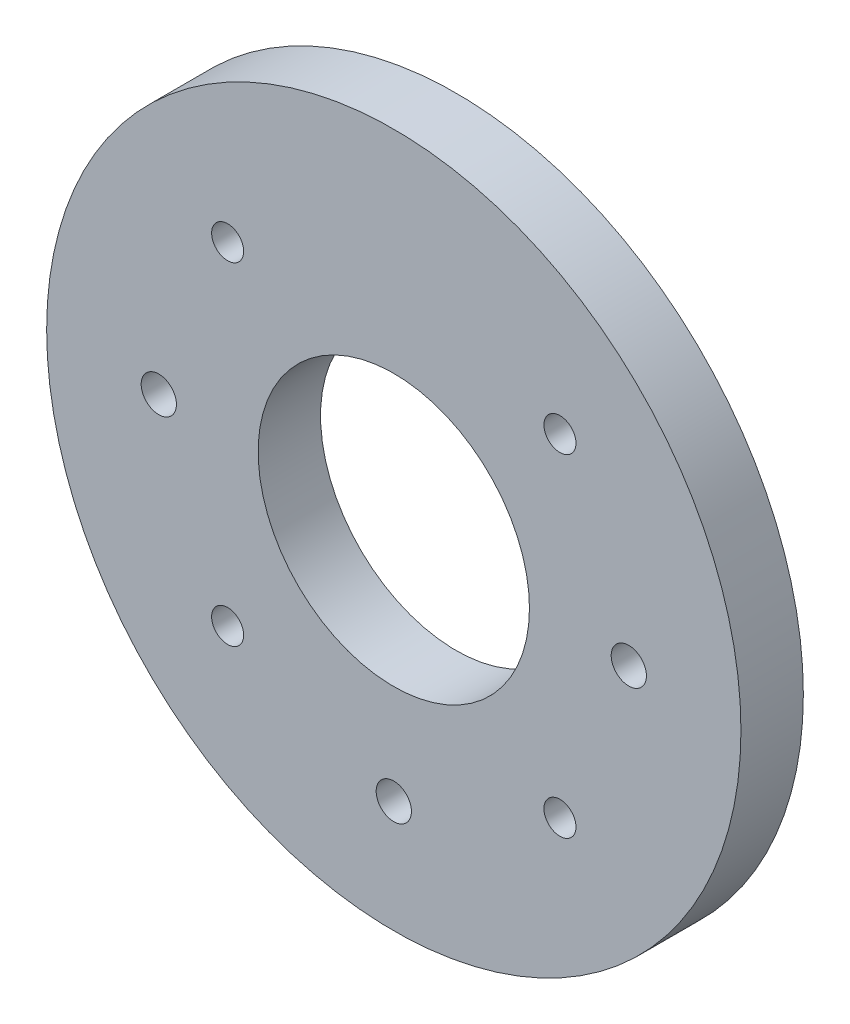
ISO-10303-21;
HEADER;
FILE_DESCRIPTION(('STEP AP214'),'2;1');
FILE_NAME('part.step','',(''),(''),'','','');
FILE_SCHEMA(('AUTOMOTIVE_DESIGN { 1 0 10303 214 1 1 1 1 }'));
ENDSEC;
DATA;
#1=APPLICATION_CONTEXT('core data for automotive mechanical design processes');
#2=APPLICATION_PROTOCOL_DEFINITION('international standard','automotive_design',2000,#1);
#3=PRODUCT_CONTEXT('',#1,'mechanical');
#4=PRODUCT('Part','Part','',(#3));
#5=PRODUCT_RELATED_PRODUCT_CATEGORY('part','',(#4));
#6=PRODUCT_DEFINITION_FORMATION('','',#4);
#7=PRODUCT_DEFINITION_CONTEXT('part definition',#1,'design');
#8=PRODUCT_DEFINITION('design','',#6,#7);
#9=PRODUCT_DEFINITION_SHAPE('','',#8);
#10=(LENGTH_UNIT() NAMED_UNIT(*) SI_UNIT(.MILLI.,.METRE.));
#11=(NAMED_UNIT(*) PLANE_ANGLE_UNIT() SI_UNIT($,.RADIAN.));
#12=(NAMED_UNIT(*) SI_UNIT($,.STERADIAN.) SOLID_ANGLE_UNIT());
#13=UNCERTAINTY_MEASURE_WITH_UNIT(LENGTH_MEASURE(1.E-05),#10,'distance_accuracy_value','');
#14=(GEOMETRIC_REPRESENTATION_CONTEXT(3) GLOBAL_UNCERTAINTY_ASSIGNED_CONTEXT((#13)) GLOBAL_UNIT_ASSIGNED_CONTEXT((#10,
#11,#12)) REPRESENTATION_CONTEXT('',''));
#15=CARTESIAN_POINT('',(0.,0.,0.));
#16=DIRECTION('',(0.,0.,1.));
#17=DIRECTION('',(1.,0.,0.));
#18=AXIS2_PLACEMENT_3D('',#15,#16,#17);
#19=CARTESIAN_POINT('',(0.,0.,5.842));
#20=DIRECTION('',(0.,0.,-1.));
#21=DIRECTION('',(-1.,0.,0.));
#22=AXIS2_PLACEMENT_3D('',#19,#20,#21);
#23=CYLINDRICAL_SURFACE('',#22,12.7);
#24=CARTESIAN_POINT('',(0.,0.,5.842));
#25=DIRECTION('',(0.,0.,1.));
#26=DIRECTION('',(1.,0.,0.));
#27=AXIS2_PLACEMENT_3D('',#24,#25,#26);
#28=CIRCLE('',#27,12.7);
#29=CARTESIAN_POINT('',(12.7,0.,5.842));
#30=VERTEX_POINT('',#29);
#31=EDGE_CURVE('E41',#30,#30,#28,.T.);
#32=ORIENTED_EDGE('',*,*,#31,.T.);
#33=EDGE_LOOP('',(#32));
#34=FACE_BOUND('',#33,.T.);
#35=CARTESIAN_POINT('',(0.,0.,0.));
#36=DIRECTION('',(0.,0.,1.));
#37=DIRECTION('',(1.,0.,0.));
#38=AXIS2_PLACEMENT_3D('',#35,#36,#37);
#39=CIRCLE('',#38,12.7);
#40=CARTESIAN_POINT('',(12.7,0.,0.));
#41=VERTEX_POINT('',#40);
#42=EDGE_CURVE('E59',#41,#41,#39,.T.);
#43=ORIENTED_EDGE('',*,*,#42,.F.);
#44=EDGE_LOOP('',(#43));
#45=FACE_BOUND('',#44,.T.);
#46=ADVANCED_FACE('F33',(#34,#45),#23,.F.);
#47=CARTESIAN_POINT('',(22.,0.,5.842));
#48=DIRECTION('',(0.,0.,-1.));
#49=DIRECTION('',(-1.,0.,0.));
#50=AXIS2_PLACEMENT_3D('',#47,#48,#49);
#51=CYLINDRICAL_SURFACE('',#50,1.65);
#52=CARTESIAN_POINT('',(22.,0.,5.842));
#53=DIRECTION('',(0.,0.,1.));
#54=DIRECTION('',(1.,0.,0.));
#55=AXIS2_PLACEMENT_3D('',#52,#53,#54);
#56=CIRCLE('',#55,1.65);
#57=CARTESIAN_POINT('',(23.65,0.,5.842));
#58=VERTEX_POINT('',#57);
#59=EDGE_CURVE('E46',#58,#58,#56,.T.);
#60=ORIENTED_EDGE('',*,*,#59,.T.);
#61=EDGE_LOOP('',(#60));
#62=FACE_BOUND('',#61,.T.);
#63=CARTESIAN_POINT('',(22.,0.,0.));
#64=DIRECTION('',(0.,0.,1.));
#65=DIRECTION('',(1.,0.,0.));
#66=AXIS2_PLACEMENT_3D('',#63,#64,#65);
#67=CIRCLE('',#66,1.65);
#68=CARTESIAN_POINT('',(23.65,0.,0.));
#69=VERTEX_POINT('',#68);
#70=EDGE_CURVE('E57',#69,#69,#67,.T.);
#71=ORIENTED_EDGE('',*,*,#70,.F.);
#72=EDGE_LOOP('',(#71));
#73=FACE_BOUND('',#72,.T.);
#74=ADVANCED_FACE('F80',(#62,#73),#51,.F.);
#75=CARTESIAN_POINT('',(0.,-22.,5.842));
#76=DIRECTION('',(0.,0.,-1.));
#77=DIRECTION('',(-1.,0.,0.));
#78=AXIS2_PLACEMENT_3D('',#75,#76,#77);
#79=CYLINDRICAL_SURFACE('',#78,1.65);
#80=CARTESIAN_POINT('',(0.,-22.,5.842));
#81=DIRECTION('',(0.,0.,1.));
#82=DIRECTION('',(1.,0.,0.));
#83=AXIS2_PLACEMENT_3D('',#80,#81,#82);
#84=CIRCLE('',#83,1.65);
#85=CARTESIAN_POINT('',(1.65,-22.,5.842));
#86=VERTEX_POINT('',#85);
#87=EDGE_CURVE('E68',#86,#86,#84,.T.);
#88=ORIENTED_EDGE('',*,*,#87,.T.);
#89=EDGE_LOOP('',(#88));
#90=FACE_BOUND('',#89,.T.);
#91=CARTESIAN_POINT('',(0.,-22.,0.));
#92=DIRECTION('',(0.,0.,1.));
#93=DIRECTION('',(1.,0.,0.));
#94=AXIS2_PLACEMENT_3D('',#91,#92,#93);
#95=CIRCLE('',#94,1.65);
#96=CARTESIAN_POINT('',(1.65,-22.,0.));
#97=VERTEX_POINT('',#96);
#98=EDGE_CURVE('E53',#97,#97,#95,.T.);
#99=ORIENTED_EDGE('',*,*,#98,.F.);
#100=EDGE_LOOP('',(#99));
#101=FACE_BOUND('',#100,.T.);
#102=ADVANCED_FACE('F98',(#90,#101),#79,.F.);
#103=CARTESIAN_POINT('',(-22.,0.,5.842));
#104=DIRECTION('',(0.,0.,-1.));
#105=DIRECTION('',(-1.,0.,0.));
#106=AXIS2_PLACEMENT_3D('',#103,#104,#105);
#107=CYLINDRICAL_SURFACE('',#106,1.65);
#108=CARTESIAN_POINT('',(-22.,0.,5.842));
#109=DIRECTION('',(0.,0.,1.));
#110=DIRECTION('',(1.,0.,0.));
#111=AXIS2_PLACEMENT_3D('',#108,#109,#110);
#112=CIRCLE('',#111,1.65);
#113=CARTESIAN_POINT('',(-20.35,0.,5.842));
#114=VERTEX_POINT('',#113);
#115=EDGE_CURVE('E64',#114,#114,#112,.T.);
#116=ORIENTED_EDGE('',*,*,#115,.T.);
#117=EDGE_LOOP('',(#116));
#118=FACE_BOUND('',#117,.T.);
#119=CARTESIAN_POINT('',(-22.,0.,0.));
#120=DIRECTION('',(0.,0.,1.));
#121=DIRECTION('',(1.,0.,0.));
#122=AXIS2_PLACEMENT_3D('',#119,#120,#121);
#123=CIRCLE('',#122,1.65);
#124=CARTESIAN_POINT('',(-20.35,0.,0.));
#125=VERTEX_POINT('',#124);
#126=EDGE_CURVE('E50',#125,#125,#123,.T.);
#127=ORIENTED_EDGE('',*,*,#126,.F.);
#128=EDGE_LOOP('',(#127));
#129=FACE_BOUND('',#128,.T.);
#130=ADVANCED_FACE('F35',(#118,#129),#107,.F.);
#131=CARTESIAN_POINT('',(0.,0.,5.842));
#132=DIRECTION('',(0.,0.,-1.));
#133=DIRECTION('',(-1.,0.,0.));
#134=AXIS2_PLACEMENT_3D('',#131,#132,#133);
#135=CYLINDRICAL_SURFACE('',#134,32.5);
#136=CARTESIAN_POINT('',(0.,0.,5.842));
#137=DIRECTION('',(0.,0.,1.));
#138=DIRECTION('',(1.,0.,0.));
#139=AXIS2_PLACEMENT_3D('',#136,#137,#138);
#140=CIRCLE('',#139,32.5);
#141=CARTESIAN_POINT('',(32.5,0.,5.842));
#142=VERTEX_POINT('',#141);
#143=EDGE_CURVE('E10',#142,#142,#140,.T.);
#144=ORIENTED_EDGE('',*,*,#143,.F.);
#145=EDGE_LOOP('',(#144));
#146=FACE_BOUND('',#145,.T.);
#147=CARTESIAN_POINT('',(0.,0.,0.));
#148=DIRECTION('',(0.,0.,1.));
#149=DIRECTION('',(1.,0.,0.));
#150=AXIS2_PLACEMENT_3D('',#147,#148,#149);
#151=CIRCLE('',#150,32.5);
#152=CARTESIAN_POINT('',(32.5,0.,0.));
#153=VERTEX_POINT('',#152);
#154=EDGE_CURVE('E37',#153,#153,#151,.T.);
#155=ORIENTED_EDGE('',*,*,#154,.T.);
#156=EDGE_LOOP('',(#155));
#157=FACE_BOUND('',#156,.T.);
#158=ADVANCED_FACE('F87',(#146,#157),#135,.T.);
#159=CARTESIAN_POINT('',(0.,0.,5.842));
#160=DIRECTION('',(0.,0.,1.));
#161=DIRECTION('',(1.,0.,0.));
#162=AXIS2_PLACEMENT_3D('',#159,#160,#161);
#163=PLANE('',#162);
#164=CARTESIAN_POINT('',(15.5563491861041,-15.556349186104,5.842));
#165=DIRECTION('',(0.,0.,1.));
#166=DIRECTION('',(1.,0.,0.));
#167=AXIS2_PLACEMENT_3D('',#164,#165,#166);
#168=CIRCLE('',#167,1.5);
#169=CARTESIAN_POINT('',(17.0563491861041,-15.556349186104,5.842));
#170=VERTEX_POINT('',#169);
#171=EDGE_CURVE('E143',#170,#170,#168,.T.);
#172=ORIENTED_EDGE('',*,*,#171,.F.);
#173=EDGE_LOOP('',(#172));
#174=FACE_BOUND('',#173,.T.);
#175=CARTESIAN_POINT('',(15.556349186104,15.5563491861041,5.842));
#176=DIRECTION('',(0.,0.,1.));
#177=DIRECTION('',(1.,0.,0.));
#178=AXIS2_PLACEMENT_3D('',#175,#176,#177);
#179=CIRCLE('',#178,1.5);
#180=CARTESIAN_POINT('',(17.056349186104,15.5563491861041,5.842));
#181=VERTEX_POINT('',#180);
#182=EDGE_CURVE('E145',#181,#181,#179,.T.);
#183=ORIENTED_EDGE('',*,*,#182,.F.);
#184=EDGE_LOOP('',(#183));
#185=FACE_BOUND('',#184,.T.);
#186=CARTESIAN_POINT('',(-15.5563491861041,15.556349186104,5.842));
#187=DIRECTION('',(0.,0.,1.));
#188=DIRECTION('',(1.,0.,0.));
#189=AXIS2_PLACEMENT_3D('',#186,#187,#188);
#190=CIRCLE('',#189,1.5);
#191=CARTESIAN_POINT('',(-14.0563491861041,15.556349186104,5.842));
#192=VERTEX_POINT('',#191);
#193=EDGE_CURVE('E151',#192,#192,#190,.T.);
#194=ORIENTED_EDGE('',*,*,#193,.F.);
#195=EDGE_LOOP('',(#194));
#196=FACE_BOUND('',#195,.T.);
#197=CARTESIAN_POINT('',(-15.556349186104,-15.5563491861041,5.842));
#198=DIRECTION('',(0.,0.,1.));
#199=DIRECTION('',(1.,0.,0.));
#200=AXIS2_PLACEMENT_3D('',#197,#198,#199);
#201=CIRCLE('',#200,1.5);
#202=CARTESIAN_POINT('',(-14.056349186104,-15.5563491861041,5.842));
#203=VERTEX_POINT('',#202);
#204=EDGE_CURVE('E75',#203,#203,#201,.T.);
#205=ORIENTED_EDGE('',*,*,#204,.F.);
#206=EDGE_LOOP('',(#205));
#207=FACE_BOUND('',#206,.T.);
#208=ORIENTED_EDGE('',*,*,#115,.F.);
#209=EDGE_LOOP('',(#208));
#210=FACE_BOUND('',#209,.T.);
#211=ORIENTED_EDGE('',*,*,#87,.F.);
#212=EDGE_LOOP('',(#211));
#213=FACE_BOUND('',#212,.T.);
#214=ORIENTED_EDGE('',*,*,#59,.F.);
#215=EDGE_LOOP('',(#214));
#216=FACE_BOUND('',#215,.T.);
#217=ORIENTED_EDGE('',*,*,#31,.F.);
#218=EDGE_LOOP('',(#217));
#219=FACE_BOUND('',#218,.T.);
#220=ORIENTED_EDGE('',*,*,#143,.T.);
#221=EDGE_LOOP('',(#220));
#222=FACE_BOUND('',#221,.T.);
#223=ADVANCED_FACE('F83',(#174,#185,#196,#207,#210,#213,#216,#219,#222),#163,.T.);
#224=CARTESIAN_POINT('',(0.,0.,0.));
#225=DIRECTION('',(0.,0.,1.));
#226=DIRECTION('',(1.,0.,0.));
#227=AXIS2_PLACEMENT_3D('',#224,#225,#226);
#228=PLANE('',#227);
#229=CARTESIAN_POINT('',(15.5563491861041,-15.556349186104,0.));
#230=DIRECTION('',(0.,0.,1.));
#231=DIRECTION('',(1.,0.,0.));
#232=AXIS2_PLACEMENT_3D('',#229,#230,#231);
#233=CIRCLE('',#232,1.5);
#234=CARTESIAN_POINT('',(17.0563491861041,-15.556349186104,0.));
#235=VERTEX_POINT('',#234);
#236=EDGE_CURVE('E140',#235,#235,#233,.T.);
#237=ORIENTED_EDGE('',*,*,#236,.T.);
#238=EDGE_LOOP('',(#237));
#239=FACE_BOUND('',#238,.T.);
#240=CARTESIAN_POINT('',(15.556349186104,15.5563491861041,0.));
#241=DIRECTION('',(0.,0.,1.));
#242=DIRECTION('',(1.,0.,0.));
#243=AXIS2_PLACEMENT_3D('',#240,#241,#242);
#244=CIRCLE('',#243,1.5);
#245=CARTESIAN_POINT('',(17.056349186104,15.5563491861041,0.));
#246=VERTEX_POINT('',#245);
#247=EDGE_CURVE('E148',#246,#246,#244,.T.);
#248=ORIENTED_EDGE('',*,*,#247,.T.);
#249=EDGE_LOOP('',(#248));
#250=FACE_BOUND('',#249,.T.);
#251=CARTESIAN_POINT('',(-15.5563491861041,15.556349186104,0.));
#252=DIRECTION('',(0.,0.,1.));
#253=DIRECTION('',(1.,0.,0.));
#254=AXIS2_PLACEMENT_3D('',#251,#252,#253);
#255=CIRCLE('',#254,1.5);
#256=CARTESIAN_POINT('',(-14.0563491861041,15.556349186104,0.));
#257=VERTEX_POINT('',#256);
#258=EDGE_CURVE('E154',#257,#257,#255,.T.);
#259=ORIENTED_EDGE('',*,*,#258,.T.);
#260=EDGE_LOOP('',(#259));
#261=FACE_BOUND('',#260,.T.);
#262=CARTESIAN_POINT('',(-15.556349186104,-15.5563491861041,0.));
#263=DIRECTION('',(0.,0.,1.));
#264=DIRECTION('',(1.,0.,0.));
#265=AXIS2_PLACEMENT_3D('',#262,#263,#264);
#266=CIRCLE('',#265,1.5);
#267=CARTESIAN_POINT('',(-14.056349186104,-15.5563491861041,0.));
#268=VERTEX_POINT('',#267);
#269=EDGE_CURVE('E54',#268,#268,#266,.T.);
#270=ORIENTED_EDGE('',*,*,#269,.T.);
#271=EDGE_LOOP('',(#270));
#272=FACE_BOUND('',#271,.T.);
#273=ORIENTED_EDGE('',*,*,#126,.T.);
#274=EDGE_LOOP('',(#273));
#275=FACE_BOUND('',#274,.T.);
#276=ORIENTED_EDGE('',*,*,#98,.T.);
#277=EDGE_LOOP('',(#276));
#278=FACE_BOUND('',#277,.T.);
#279=ORIENTED_EDGE('',*,*,#70,.T.);
#280=EDGE_LOOP('',(#279));
#281=FACE_BOUND('',#280,.T.);
#282=ORIENTED_EDGE('',*,*,#42,.T.);
#283=EDGE_LOOP('',(#282));
#284=FACE_BOUND('',#283,.T.);
#285=ORIENTED_EDGE('',*,*,#154,.F.);
#286=EDGE_LOOP('',(#285));
#287=FACE_BOUND('',#286,.T.);
#288=ADVANCED_FACE('F86',(#239,#250,#261,#272,#275,#278,#281,#284,#287),#228,.F.);
#289=CARTESIAN_POINT('',(-15.556349186104,-15.5563491861041,0.));
#290=DIRECTION('',(0.,0.,1.));
#291=DIRECTION('',(1.,0.,0.));
#292=AXIS2_PLACEMENT_3D('',#289,#290,#291);
#293=CYLINDRICAL_SURFACE('',#292,1.5);
#294=ORIENTED_EDGE('',*,*,#269,.F.);
#295=EDGE_LOOP('',(#294));
#296=FACE_BOUND('',#295,.T.);
#297=ORIENTED_EDGE('',*,*,#204,.T.);
#298=EDGE_LOOP('',(#297));
#299=FACE_BOUND('',#298,.T.);
#300=ADVANCED_FACE('F113',(#296,#299),#293,.F.);
#301=CARTESIAN_POINT('',(-15.5563491861041,15.556349186104,0.));
#302=DIRECTION('',(0.,0.,1.));
#303=DIRECTION('',(1.,0.,0.));
#304=AXIS2_PLACEMENT_3D('',#301,#302,#303);
#305=CYLINDRICAL_SURFACE('',#304,1.5);
#306=ORIENTED_EDGE('',*,*,#258,.F.);
#307=EDGE_LOOP('',(#306));
#308=FACE_BOUND('',#307,.T.);
#309=ORIENTED_EDGE('',*,*,#193,.T.);
#310=EDGE_LOOP('',(#309));
#311=FACE_BOUND('',#310,.T.);
#312=ADVANCED_FACE('F120',(#308,#311),#305,.F.);
#313=CARTESIAN_POINT('',(15.556349186104,15.5563491861041,0.));
#314=DIRECTION('',(0.,0.,1.));
#315=DIRECTION('',(1.,0.,0.));
#316=AXIS2_PLACEMENT_3D('',#313,#314,#315);
#317=CYLINDRICAL_SURFACE('',#316,1.5);
#318=ORIENTED_EDGE('',*,*,#247,.F.);
#319=EDGE_LOOP('',(#318));
#320=FACE_BOUND('',#319,.T.);
#321=ORIENTED_EDGE('',*,*,#182,.T.);
#322=EDGE_LOOP('',(#321));
#323=FACE_BOUND('',#322,.T.);
#324=ADVANCED_FACE('F128',(#320,#323),#317,.F.);
#325=CARTESIAN_POINT('',(15.5563491861041,-15.556349186104,0.));
#326=DIRECTION('',(0.,0.,1.));
#327=DIRECTION('',(1.,0.,0.));
#328=AXIS2_PLACEMENT_3D('',#325,#326,#327);
#329=CYLINDRICAL_SURFACE('',#328,1.5);
#330=ORIENTED_EDGE('',*,*,#236,.F.);
#331=EDGE_LOOP('',(#330));
#332=FACE_BOUND('',#331,.T.);
#333=ORIENTED_EDGE('',*,*,#171,.T.);
#334=EDGE_LOOP('',(#333));
#335=FACE_BOUND('',#334,.T.);
#336=ADVANCED_FACE('F132',(#332,#335),#329,.F.);
#337=CLOSED_SHELL('',(#46,#74,#102,#130,#158,#223,#288,#300,#312,#324,#336));
#338=MANIFOLD_SOLID_BREP('B2',#337);
#339=ADVANCED_BREP_SHAPE_REPRESENTATION('',(#18,#338),#14);
#340=SHAPE_DEFINITION_REPRESENTATION(#9,#339);
ENDSEC;
END-ISO-10303-21;
